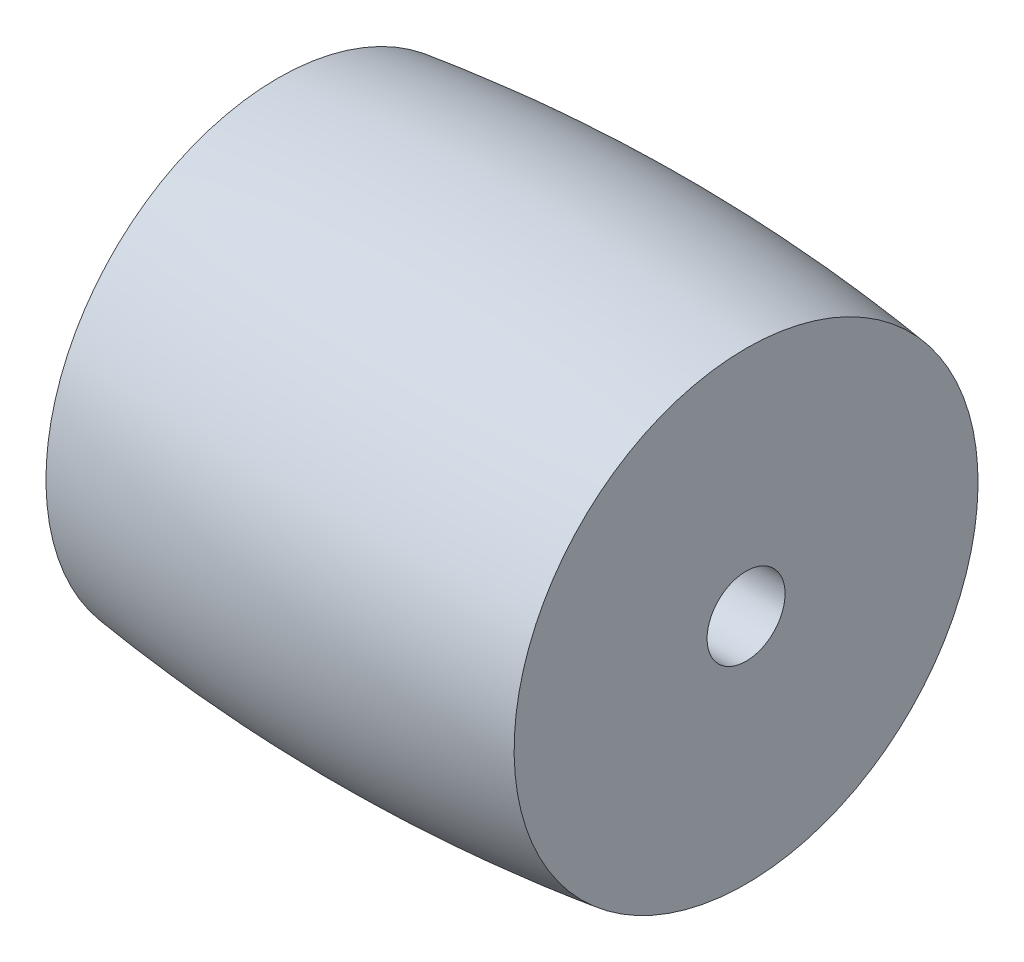
ISO-10303-21;
HEADER;
FILE_DESCRIPTION(('STEP AP214'),'2;1');
FILE_NAME('part.step','',(''),(''),'','','');
FILE_SCHEMA(('AUTOMOTIVE_DESIGN { 1 0 10303 214 1 1 1 1 }'));
ENDSEC;
DATA;
#1=APPLICATION_CONTEXT('core data for automotive mechanical design processes');
#2=APPLICATION_PROTOCOL_DEFINITION('international standard','automotive_design',2000,#1);
#3=PRODUCT_CONTEXT('',#1,'mechanical');
#4=PRODUCT('Part','Part','',(#3));
#5=PRODUCT_RELATED_PRODUCT_CATEGORY('part','',(#4));
#6=PRODUCT_DEFINITION_FORMATION('','',#4);
#7=PRODUCT_DEFINITION_CONTEXT('part definition',#1,'design');
#8=PRODUCT_DEFINITION('design','',#6,#7);
#9=PRODUCT_DEFINITION_SHAPE('','',#8);
#10=(LENGTH_UNIT() NAMED_UNIT(*) SI_UNIT(.MILLI.,.METRE.));
#11=(NAMED_UNIT(*) PLANE_ANGLE_UNIT() SI_UNIT($,.RADIAN.));
#12=(NAMED_UNIT(*) SI_UNIT($,.STERADIAN.) SOLID_ANGLE_UNIT());
#13=UNCERTAINTY_MEASURE_WITH_UNIT(LENGTH_MEASURE(1.E-05),#10,'distance_accuracy_value','');
#14=(GEOMETRIC_REPRESENTATION_CONTEXT(3) GLOBAL_UNCERTAINTY_ASSIGNED_CONTEXT((#13)) GLOBAL_UNIT_ASSIGNED_CONTEXT((#10,
#11,#12)) REPRESENTATION_CONTEXT('',''));
#15=CARTESIAN_POINT('',(0.,0.,0.));
#16=DIRECTION('',(0.,0.,1.));
#17=DIRECTION('',(1.,0.,0.));
#18=AXIS2_PLACEMENT_3D('',#15,#16,#17);
#19=CARTESIAN_POINT('',(13.,0.,0.));
#20=DIRECTION('',(1.,0.,0.));
#21=DIRECTION('',(0.,1.,0.));
#22=AXIS2_PLACEMENT_3D('',#19,#20,#21);
#23=CYLINDRICAL_SURFACE('',#22,1.50000000000002);
#24=CARTESIAN_POINT('',(9.,0.,0.));
#25=DIRECTION('',(1.,0.,0.));
#26=DIRECTION('',(0.,1.,0.));
#27=AXIS2_PLACEMENT_3D('',#24,#25,#26);
#28=CIRCLE('',#27,1.50000000000002);
#29=CARTESIAN_POINT('',(9.,1.50000000000001,0.));
#30=VERTEX_POINT('',#29);
#31=EDGE_CURVE('E27',#30,#30,#28,.F.);
#32=ORIENTED_EDGE('',*,*,#31,.F.);
#33=EDGE_LOOP('',(#32));
#34=FACE_BOUND('',#33,.T.);
#35=CARTESIAN_POINT('',(-9.,0.,0.));
#36=DIRECTION('',(1.,0.,0.));
#37=DIRECTION('',(0.,1.,0.));
#38=AXIS2_PLACEMENT_3D('',#35,#36,#37);
#39=CIRCLE('',#38,1.50000000000002);
#40=CARTESIAN_POINT('',(-9.,1.50000000000002,0.));
#41=VERTEX_POINT('',#40);
#42=EDGE_CURVE('E18',#41,#41,#39,.F.);
#43=ORIENTED_EDGE('',*,*,#42,.T.);
#44=EDGE_LOOP('',(#43));
#45=FACE_BOUND('',#44,.T.);
#46=ADVANCED_FACE('F15',(#34,#45),#23,.F.);
#47=CARTESIAN_POINT('',(-9.,0.,0.));
#48=DIRECTION('',(1.,0.,0.));
#49=DIRECTION('',(0.,1.,0.));
#50=AXIS2_PLACEMENT_3D('',#47,#48,#49);
#51=PLANE('',#50);
#52=ORIENTED_EDGE('',*,*,#42,.F.);
#53=EDGE_LOOP('',(#52));
#54=FACE_BOUND('',#53,.T.);
#55=CARTESIAN_POINT('',(-9.,0.,0.));
#56=DIRECTION('',(1.,0.,0.));
#57=DIRECTION('',(0.,1.,0.));
#58=AXIS2_PLACEMENT_3D('',#55,#56,#57);
#59=CIRCLE('',#58,8.91901756723443);
#60=CARTESIAN_POINT('',(-8.99999999999999,8.91901756723443,0.));
#61=VERTEX_POINT('',#60);
#62=EDGE_CURVE('E22',#61,#61,#59,.T.);
#63=ORIENTED_EDGE('',*,*,#62,.F.);
#64=EDGE_LOOP('',(#63));
#65=FACE_BOUND('',#64,.T.);
#66=ADVANCED_FACE('F38',(#54,#65),#51,.F.);
#67=CARTESIAN_POINT('',(9.00000000000001,0.,0.));
#68=DIRECTION('',(1.,0.,0.));
#69=DIRECTION('',(0.,1.,0.));
#70=AXIS2_PLACEMENT_3D('',#67,#68,#69);
#71=PLANE('',#70);
#72=ORIENTED_EDGE('',*,*,#31,.T.);
#73=EDGE_LOOP('',(#72));
#74=FACE_BOUND('',#73,.T.);
#75=CARTESIAN_POINT('',(9.00000000000001,0.,0.));
#76=DIRECTION('',(1.,0.,0.));
#77=DIRECTION('',(0.,1.,0.));
#78=AXIS2_PLACEMENT_3D('',#75,#76,#77);
#79=CIRCLE('',#78,8.91901756723442);
#80=CARTESIAN_POINT('',(9.00000000000001,8.91901756723442,0.));
#81=VERTEX_POINT('',#80);
#82=EDGE_CURVE('E10',#81,#81,#79,.F.);
#83=ORIENTED_EDGE('',*,*,#82,.F.);
#84=EDGE_LOOP('',(#83));
#85=FACE_BOUND('',#84,.T.);
#86=ADVANCED_FACE('F41',(#74,#85),#71,.T.);
#87=CARTESIAN_POINT('',(0.,-60.5,0.));
#88=DIRECTION('',(0.,0.,1.));
#89=DIRECTION('',(0.,1.,0.));
#90=AXIS2_PLACEMENT_3D('',#87,#88,#89);
#91=CIRCLE('',#90,70.);
#92=TRIMMED_CURVE('',#91,(PARAMETER_VALUE(-0.527067740061205)),
(PARAMETER_VALUE(0.527067740061205)),.T.,.PARAMETER.);
#93=CARTESIAN_POINT('',(0.,0.,0.));
#94=DIRECTION('',(1.,0.,0.));
#95=AXIS1_PLACEMENT('',#93,#94);
#96=SURFACE_OF_REVOLUTION('',#92,#95);
#97=ORIENTED_EDGE('',*,*,#62,.T.);
#98=EDGE_LOOP('',(#97));
#99=FACE_BOUND('',#98,.T.);
#100=ORIENTED_EDGE('',*,*,#82,.T.);
#101=EDGE_LOOP('',(#100));
#102=FACE_BOUND('',#101,.T.);
#103=ADVANCED_FACE('F44',(#99,#102),#96,.F.);
#104=CLOSED_SHELL('',(#46,#66,#86,#103));
#105=MANIFOLD_SOLID_BREP('B1',#104);
#106=ADVANCED_BREP_SHAPE_REPRESENTATION('',(#18,#105),#14);
#107=SHAPE_DEFINITION_REPRESENTATION(#9,#106);
ENDSEC;
END-ISO-10303-21;
